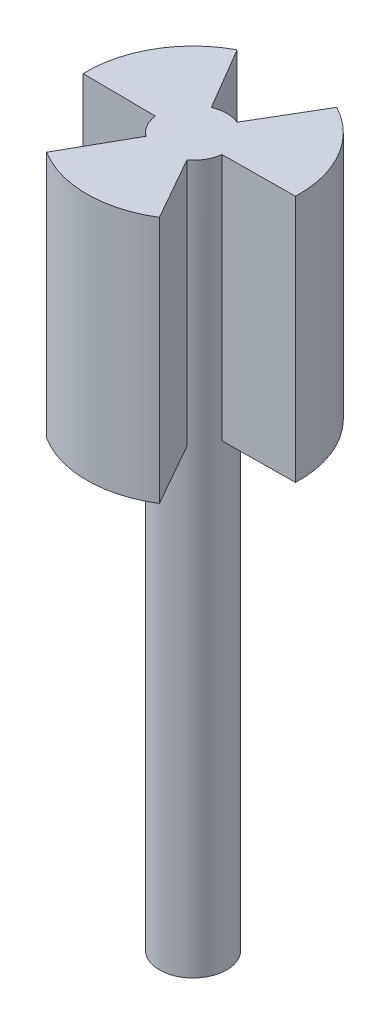
ISO-10303-21;
HEADER;
FILE_DESCRIPTION(('STEP AP214'),'2;1');
FILE_NAME('part.step','',(''),(''),'','','');
FILE_SCHEMA(('AUTOMOTIVE_DESIGN { 1 0 10303 214 1 1 1 1 }'));
ENDSEC;
DATA;
#1=APPLICATION_CONTEXT('core data for automotive mechanical design processes');
#2=APPLICATION_PROTOCOL_DEFINITION('international standard','automotive_design',2000,#1);
#3=PRODUCT_CONTEXT('',#1,'mechanical');
#4=PRODUCT('Part','Part','',(#3));
#5=PRODUCT_RELATED_PRODUCT_CATEGORY('part','',(#4));
#6=PRODUCT_DEFINITION_FORMATION('','',#4);
#7=PRODUCT_DEFINITION_CONTEXT('part definition',#1,'design');
#8=PRODUCT_DEFINITION('design','',#6,#7);
#9=PRODUCT_DEFINITION_SHAPE('','',#8);
#10=(LENGTH_UNIT() NAMED_UNIT(*) SI_UNIT(.MILLI.,.METRE.));
#11=(NAMED_UNIT(*) PLANE_ANGLE_UNIT() SI_UNIT($,.RADIAN.));
#12=(NAMED_UNIT(*) SI_UNIT($,.STERADIAN.) SOLID_ANGLE_UNIT());
#13=UNCERTAINTY_MEASURE_WITH_UNIT(LENGTH_MEASURE(1.E-05),#10,'distance_accuracy_value','');
#14=(GEOMETRIC_REPRESENTATION_CONTEXT(3) GLOBAL_UNCERTAINTY_ASSIGNED_CONTEXT((#13)) GLOBAL_UNIT_ASSIGNED_CONTEXT((#10,
#11,#12)) REPRESENTATION_CONTEXT('',''));
#15=CARTESIAN_POINT('',(0.,0.,0.));
#16=DIRECTION('',(0.,0.,1.));
#17=DIRECTION('',(1.,0.,0.));
#18=AXIS2_PLACEMENT_3D('',#15,#16,#17);
#19=CARTESIAN_POINT('',(0.,200.,0.));
#20=DIRECTION('',(0.,1.,0.));
#21=DIRECTION('',(0.,0.,1.));
#22=AXIS2_PLACEMENT_3D('',#19,#20,#21);
#23=PLANE('',#22);
#24=DIRECTION('',(-0.492207128969492,0.,-0.870478111265074));
#25=VECTOR('',#24,1.);
#26=CARTESIAN_POINT('',(22.4530319302345,200.,36.987220273007));
#27=LINE('',#26,#25);
#28=CARTESIAN_POINT('',(15.9174922571403,200.,25.428988187576));
#29=VERTEX_POINT('',#28);
#30=CARTESIAN_POINT('',(5.79525781005714,200.,7.5276149552811));
#31=VERTEX_POINT('',#30);
#32=EDGE_CURVE('E131',#29,#31,#27,.T.);
#33=ORIENTED_EDGE('',*,*,#32,.T.);
#34=CARTESIAN_POINT('',(0.,200.,0.));
#35=DIRECTION('',(0.,1.,0.));
#36=DIRECTION('',(0.866025403784443,0.,0.499999999999992));
#37=AXIS2_PLACEMENT_3D('',#34,#35,#36);
#38=CIRCLE('',#37,9.49999999999999);
#39=CARTESIAN_POINT('',(9.41673468620969,200.,1.25503300734893));
#40=VERTEX_POINT('',#39);
#41=EDGE_CURVE('E138',#31,#40,#38,.T.);
#42=ORIENTED_EDGE('',*,*,#41,.T.);
#43=DIRECTION('',(0.999959722278597,0.,-0.00897517802117143));
#44=VECTOR('',#43,1.);
#45=CARTESIAN_POINT('',(43.2583883369122,200.,0.951285907061967));
#46=LINE('',#45,#44);
#47=CARTESIAN_POINT('',(29.9808958915454,200.,1.07045856543703));
#48=VERTEX_POINT('',#47);
#49=EDGE_CURVE('E135',#40,#48,#46,.T.);
#50=ORIENTED_EDGE('',*,*,#49,.T.);
#51=CARTESIAN_POINT('',(0.,200.,0.));
#52=DIRECTION('',(0.,1.,0.));
#53=DIRECTION('',(0.,0.,1.));
#54=AXIS2_PLACEMENT_3D('',#51,#52,#53);
#55=CIRCLE('',#54,30.);
#56=CARTESIAN_POINT('',(14.0634036344053,200.,-26.4994467530134));
#57=VERTEX_POINT('',#56);
#58=EDGE_CURVE('E196',#48,#57,#55,.T.);
#59=ORIENTED_EDGE('',*,*,#58,.T.);
#60=DIRECTION('',(0.507752593309113,0.,-0.861502933243916));
#61=VECTOR('',#60,1.);
#62=CARTESIAN_POINT('',(-1.15398259986249,200.,-0.680134257358214));
#63=LINE('',#62,#61);
#64=CARTESIAN_POINT('',(3.62147687615261,200.,-8.78264796263017));
#65=VERTEX_POINT('',#64);
#66=EDGE_CURVE('E212',#65,#57,#63,.T.);
#67=ORIENTED_EDGE('',*,*,#66,.F.);
#68=CARTESIAN_POINT('',(0.,200.,0.));
#69=DIRECTION('',(0.,1.,0.));
#70=DIRECTION('',(0.,0.,-1.));
#71=AXIS2_PLACEMENT_3D('',#68,#69,#70);
#72=CIRCLE('',#71,9.49999999999999);
#73=CARTESIAN_POINT('',(-3.6214768761526,200.,-8.78264796263017));
#74=VERTEX_POINT('',#73);
#75=EDGE_CURVE('E176',#65,#74,#72,.T.);
#76=ORIENTED_EDGE('',*,*,#75,.T.);
#77=DIRECTION('',(-0.507752593309113,0.,-0.861502933243916));
#78=VECTOR('',#77,1.);
#79=CARTESIAN_POINT('',(-20.805356406678,200.,-37.9385061800696));
#80=LINE('',#79,#78);
#81=CARTESIAN_POINT('',(-14.0634036344053,200.,-26.4994467530134));
#82=VERTEX_POINT('',#81);
#83=EDGE_CURVE('E179',#74,#82,#80,.T.);
#84=ORIENTED_EDGE('',*,*,#83,.T.);
#85=CARTESIAN_POINT('',(-29.9808958915454,200.,1.07045856543743));
#86=VERTEX_POINT('',#85);
#87=EDGE_CURVE('E203',#82,#86,#55,.T.);
#88=ORIENTED_EDGE('',*,*,#87,.T.);
#89=DIRECTION('',(0.999959722278597,0.,0.00897517802115771));
#90=VECTOR('',#89,1.);
#91=CARTESIAN_POINT('',(-43.2583883369122,200.,0.951285907062557));
#92=LINE('',#91,#90);
#93=CARTESIAN_POINT('',(-9.41673468620967,200.,1.25503300734906));
#94=VERTEX_POINT('',#93);
#95=EDGE_CURVE('E159',#86,#94,#92,.T.);
#96=ORIENTED_EDGE('',*,*,#95,.T.);
#97=CARTESIAN_POINT('',(0.,200.,0.));
#98=DIRECTION('',(0.,1.,0.));
#99=DIRECTION('',(-0.866025403784436,0.,0.500000000000004));
#100=AXIS2_PLACEMENT_3D('',#97,#98,#99);
#101=CIRCLE('',#100,9.49999999999999);
#102=CARTESIAN_POINT('',(-5.79525781005704,200.,7.52761495528118));
#103=VERTEX_POINT('',#102);
#104=EDGE_CURVE('E162',#94,#103,#101,.T.);
#105=ORIENTED_EDGE('',*,*,#104,.T.);
#106=DIRECTION('',(-0.49220712896948,0.,0.870478111265081));
#107=VECTOR('',#106,1.);
#108=CARTESIAN_POINT('',(-22.4530319302341,200.,36.9872202730073));
#109=LINE('',#108,#107);
#110=CARTESIAN_POINT('',(-15.9174922571399,200.,25.4289881875762));
#111=VERTEX_POINT('',#110);
#112=EDGE_CURVE('E165',#103,#111,#109,.T.);
#113=ORIENTED_EDGE('',*,*,#112,.T.);
#114=EDGE_CURVE('E147',#111,#29,#55,.T.);
#115=ORIENTED_EDGE('',*,*,#114,.T.);
#116=EDGE_LOOP('',(#33,#42,#50,#59,#67,#76,#84,#88,#96,#105,#113,#115));
#117=FACE_BOUND('',#116,.T.);
#118=ADVANCED_FACE('F41',(#117),#23,.T.);
#119=CARTESIAN_POINT('',(0.,130.,0.));
#120=DIRECTION('',(0.,1.,0.));
#121=DIRECTION('',(0.,0.,1.));
#122=AXIS2_PLACEMENT_3D('',#119,#120,#121);
#123=CYLINDRICAL_SURFACE('',#122,30.);
#124=DIRECTION('',(0.,1.,0.));
#125=VECTOR('',#124,1.);
#126=CARTESIAN_POINT('',(15.9174922571403,130.,25.428988187576));
#127=LINE('',#126,#125);
#128=CARTESIAN_POINT('',(15.9174922571403,130.,25.428988187576));
#129=VERTEX_POINT('',#128);
#130=EDGE_CURVE('E156',#29,#129,#127,.F.);
#131=ORIENTED_EDGE('',*,*,#130,.F.);
#132=ORIENTED_EDGE('',*,*,#114,.F.);
#133=DIRECTION('',(0.,1.,0.));
#134=VECTOR('',#133,1.);
#135=CARTESIAN_POINT('',(-15.9174922571399,130.,25.4289881875762));
#136=LINE('',#135,#134);
#137=CARTESIAN_POINT('',(-15.9174922571399,130.,25.4289881875762));
#138=VERTEX_POINT('',#137);
#139=EDGE_CURVE('E170',#138,#111,#136,.T.);
#140=ORIENTED_EDGE('',*,*,#139,.F.);
#141=CARTESIAN_POINT('',(0.,130.,0.));
#142=DIRECTION('',(0.,1.,0.));
#143=DIRECTION('',(0.,0.,1.));
#144=AXIS2_PLACEMENT_3D('',#141,#142,#143);
#145=CIRCLE('',#144,30.);
#146=EDGE_CURVE('E201',#138,#129,#145,.T.);
#147=ORIENTED_EDGE('',*,*,#146,.T.);
#148=EDGE_LOOP('',(#131,#132,#140,#147));
#149=FACE_BOUND('',#148,.T.);
#150=ADVANCED_FACE('F258',(#149),#123,.T.);
#151=CARTESIAN_POINT('',(0.,130.,0.));
#152=DIRECTION('',(0.,1.,0.));
#153=DIRECTION('',(0.,0.,1.));
#154=AXIS2_PLACEMENT_3D('',#151,#152,#153);
#155=PLANE('',#154);
#156=CARTESIAN_POINT('',(0.,130.,0.));
#157=DIRECTION('',(0.,1.,0.));
#158=DIRECTION('',(0.,0.,1.));
#159=AXIS2_PLACEMENT_3D('',#156,#157,#158);
#160=CIRCLE('',#159,9.5);
#161=CARTESIAN_POINT('',(-5.79525781005704,130.,7.52761495528118));
#162=VERTEX_POINT('',#161);
#163=CARTESIAN_POINT('',(5.79525781005714,130.,7.5276149552811));
#164=VERTEX_POINT('',#163);
#165=EDGE_CURVE('E213',#162,#164,#160,.T.);
#166=ORIENTED_EDGE('',*,*,#165,.T.);
#167=DIRECTION('',(0.492207128969492,0.,0.870478111265074));
#168=VECTOR('',#167,1.);
#169=CARTESIAN_POINT('',(1.16600484478752,130.,-0.659311118327038));
#170=LINE('',#169,#168);
#171=EDGE_CURVE('E11',#164,#129,#170,.T.);
#172=ORIENTED_EDGE('',*,*,#171,.T.);
#173=ORIENTED_EDGE('',*,*,#146,.F.);
#174=DIRECTION('',(-0.49220712896948,0.,0.870478111265081));
#175=VECTOR('',#174,1.);
#176=CARTESIAN_POINT('',(-22.4530319302341,130.,36.9872202730073));
#177=LINE('',#176,#175);
#178=EDGE_CURVE('E158',#162,#138,#177,.T.);
#179=ORIENTED_EDGE('',*,*,#178,.F.);
#180=EDGE_LOOP('',(#166,#172,#173,#179));
#181=FACE_BOUND('',#180,.T.);
#182=ADVANCED_FACE('F241',(#181),#155,.F.);
#183=DIRECTION('',(0.,1.,0.));
#184=VECTOR('',#183,1.);
#185=CARTESIAN_POINT('',(-29.9808958915454,130.,1.07045856543743));
#186=LINE('',#185,#184);
#187=CARTESIAN_POINT('',(-29.9808958915454,130.,1.07045856543743));
#188=VERTEX_POINT('',#187);
#189=EDGE_CURVE('E173',#86,#188,#186,.F.);
#190=ORIENTED_EDGE('',*,*,#189,.F.);
#191=ORIENTED_EDGE('',*,*,#87,.F.);
#192=DIRECTION('',(0.,1.,0.));
#193=VECTOR('',#192,1.);
#194=CARTESIAN_POINT('',(-14.0634036344053,130.,-26.4994467530134));
#195=LINE('',#194,#193);
#196=CARTESIAN_POINT('',(-14.0634036344053,130.,-26.4994467530134));
#197=VERTEX_POINT('',#196);
#198=EDGE_CURVE('E189',#197,#82,#195,.T.);
#199=ORIENTED_EDGE('',*,*,#198,.F.);
#200=EDGE_CURVE('E197',#197,#188,#145,.T.);
#201=ORIENTED_EDGE('',*,*,#200,.T.);
#202=EDGE_LOOP('',(#190,#191,#199,#201));
#203=FACE_BOUND('',#202,.T.);
#204=ADVANCED_FACE('F224',(#203),#123,.T.);
#205=CARTESIAN_POINT('',(-3.62147687615261,130.,-8.78264796263017));
#206=VERTEX_POINT('',#205);
#207=CARTESIAN_POINT('',(-9.41673468620967,130.,1.25503300734906));
#208=VERTEX_POINT('',#207);
#209=EDGE_CURVE('E209',#206,#208,#160,.T.);
#210=ORIENTED_EDGE('',*,*,#209,.T.);
#211=DIRECTION('',(-0.999959722278597,0.,-0.00897517802115771));
#212=VECTOR('',#211,1.);
#213=CARTESIAN_POINT('',(-0.0120222449250232,130.,1.33944537568524));
#214=LINE('',#213,#212);
#215=EDGE_CURVE('E49',#208,#188,#214,.T.);
#216=ORIENTED_EDGE('',*,*,#215,.T.);
#217=ORIENTED_EDGE('',*,*,#200,.F.);
#218=DIRECTION('',(-0.507752593309113,0.,-0.861502933243916));
#219=VECTOR('',#218,1.);
#220=CARTESIAN_POINT('',(-20.805356406678,130.,-37.9385061800696));
#221=LINE('',#220,#219);
#222=EDGE_CURVE('E180',#206,#197,#221,.T.);
#223=ORIENTED_EDGE('',*,*,#222,.F.);
#224=EDGE_LOOP('',(#210,#216,#217,#223));
#225=FACE_BOUND('',#224,.T.);
#226=ADVANCED_FACE('F218',(#225),#155,.F.);
#227=CARTESIAN_POINT('',(0.,200.,0.));
#228=DIRECTION('',(0.,-1.,0.));
#229=DIRECTION('',(0.,0.,-1.));
#230=AXIS2_PLACEMENT_3D('',#227,#228,#229);
#231=CYLINDRICAL_SURFACE('',#230,9.5);
#232=CARTESIAN_POINT('',(0.,0.,0.));
#233=DIRECTION('',(0.,1.,0.));
#234=DIRECTION('',(0.,0.,1.));
#235=AXIS2_PLACEMENT_3D('',#232,#233,#234);
#236=CIRCLE('',#235,9.5);
#237=CARTESIAN_POINT('',(0.,0.,9.5));
#238=VERTEX_POINT('',#237);
#239=EDGE_CURVE('E200',#238,#238,#236,.T.);
#240=ORIENTED_EDGE('',*,*,#239,.T.);
#241=EDGE_LOOP('',(#240));
#242=FACE_BOUND('',#241,.T.);
#243=ORIENTED_EDGE('',*,*,#209,.F.);
#244=DIRECTION('',(0.,-1.,0.));
#245=VECTOR('',#244,1.);
#246=CARTESIAN_POINT('',(-3.62147687615261,200.,-8.78264796263017));
#247=LINE('',#246,#245);
#248=EDGE_CURVE('E187',#74,#206,#247,.T.);
#249=ORIENTED_EDGE('',*,*,#248,.F.);
#250=ORIENTED_EDGE('',*,*,#75,.F.);
#251=DIRECTION('',(0.,-1.,0.));
#252=VECTOR('',#251,1.);
#253=CARTESIAN_POINT('',(3.62147687615261,200.,-8.78264796263017));
#254=LINE('',#253,#252);
#255=CARTESIAN_POINT('',(3.62147687615261,130.,-8.78264796263017));
#256=VERTEX_POINT('',#255);
#257=EDGE_CURVE('E183',#65,#256,#254,.T.);
#258=ORIENTED_EDGE('',*,*,#257,.T.);
#259=CARTESIAN_POINT('',(9.41673468620969,130.,1.25503300734893));
#260=VERTEX_POINT('',#259);
#261=EDGE_CURVE('E208',#260,#256,#160,.T.);
#262=ORIENTED_EDGE('',*,*,#261,.F.);
#263=DIRECTION('',(0.,-1.,0.));
#264=VECTOR('',#263,1.);
#265=CARTESIAN_POINT('',(9.41673468620969,200.,1.25503300734893));
#266=LINE('',#265,#264);
#267=EDGE_CURVE('E134',#40,#260,#266,.T.);
#268=ORIENTED_EDGE('',*,*,#267,.F.);
#269=ORIENTED_EDGE('',*,*,#41,.F.);
#270=DIRECTION('',(0.,-1.,0.));
#271=VECTOR('',#270,1.);
#272=CARTESIAN_POINT('',(5.79525781005714,200.,7.5276149552811));
#273=LINE('',#272,#271);
#274=EDGE_CURVE('E56',#31,#164,#273,.T.);
#275=ORIENTED_EDGE('',*,*,#274,.T.);
#276=ORIENTED_EDGE('',*,*,#165,.F.);
#277=DIRECTION('',(0.,-1.,0.));
#278=VECTOR('',#277,1.);
#279=CARTESIAN_POINT('',(-5.79525781005704,200.,7.52761495528118));
#280=LINE('',#279,#278);
#281=EDGE_CURVE('E168',#103,#162,#280,.T.);
#282=ORIENTED_EDGE('',*,*,#281,.F.);
#283=ORIENTED_EDGE('',*,*,#104,.F.);
#284=DIRECTION('',(0.,-1.,0.));
#285=VECTOR('',#284,1.);
#286=CARTESIAN_POINT('',(-9.41673468620967,200.,1.25503300734906));
#287=LINE('',#286,#285);
#288=EDGE_CURVE('E63',#94,#208,#287,.T.);
#289=ORIENTED_EDGE('',*,*,#288,.T.);
#290=EDGE_LOOP('',(#243,#249,#250,#258,#262,#268,#269,#275,#276,#282,#283,#289));
#291=FACE_BOUND('',#290,.T.);
#292=ADVANCED_FACE('F43',(#242,#291),#231,.T.);
#293=CARTESIAN_POINT('',(0.,0.,0.));
#294=DIRECTION('',(0.,1.,0.));
#295=DIRECTION('',(0.,0.,1.));
#296=AXIS2_PLACEMENT_3D('',#293,#294,#295);
#297=PLANE('',#296);
#298=ORIENTED_EDGE('',*,*,#239,.F.);
#299=EDGE_LOOP('',(#298));
#300=FACE_BOUND('',#299,.T.);
#301=ADVANCED_FACE('F267',(#300),#297,.F.);
#302=DIRECTION('',(0.,1.,0.));
#303=VECTOR('',#302,1.);
#304=CARTESIAN_POINT('',(29.9808958915454,130.,1.07045856543703));
#305=LINE('',#304,#303);
#306=CARTESIAN_POINT('',(29.9808958915454,130.,1.07045856543703));
#307=VERTEX_POINT('',#306);
#308=EDGE_CURVE('E153',#307,#48,#305,.T.);
#309=ORIENTED_EDGE('',*,*,#308,.F.);
#310=CARTESIAN_POINT('',(14.0634036344053,130.,-26.4994467530134));
#311=VERTEX_POINT('',#310);
#312=EDGE_CURVE('E202',#307,#311,#145,.T.);
#313=ORIENTED_EDGE('',*,*,#312,.T.);
#314=DIRECTION('',(0.,1.,0.));
#315=VECTOR('',#314,1.);
#316=CARTESIAN_POINT('',(14.0634036344053,130.,-26.4994467530134));
#317=LINE('',#316,#315);
#318=EDGE_CURVE('E193',#57,#311,#317,.F.);
#319=ORIENTED_EDGE('',*,*,#318,.F.);
#320=ORIENTED_EDGE('',*,*,#58,.F.);
#321=EDGE_LOOP('',(#309,#313,#319,#320));
#322=FACE_BOUND('',#321,.T.);
#323=ADVANCED_FACE('F265',(#322),#123,.T.);
#324=ORIENTED_EDGE('',*,*,#312,.F.);
#325=DIRECTION('',(0.999959722278597,0.,-0.00897517802117143));
#326=VECTOR('',#325,1.);
#327=CARTESIAN_POINT('',(43.2583883369122,130.,0.951285907061967));
#328=LINE('',#327,#326);
#329=EDGE_CURVE('E148',#260,#307,#328,.T.);
#330=ORIENTED_EDGE('',*,*,#329,.F.);
#331=ORIENTED_EDGE('',*,*,#261,.T.);
#332=DIRECTION('',(-0.507752593309113,0.,0.861502933243916));
#333=VECTOR('',#332,1.);
#334=CARTESIAN_POINT('',(20.805356406678,130.,-37.9385061800696));
#335=LINE('',#334,#333);
#336=EDGE_CURVE('E175',#311,#256,#335,.T.);
#337=ORIENTED_EDGE('',*,*,#336,.F.);
#338=EDGE_LOOP('',(#324,#330,#331,#337));
#339=FACE_BOUND('',#338,.T.);
#340=ADVANCED_FACE('F237',(#339),#155,.F.);
#341=CARTESIAN_POINT('',(20.805356406678,200.,-37.9385061800696));
#342=DIRECTION('',(0.861502933243916,0.,0.507752593309113));
#343=DIRECTION('',(0.507752593309113,0.,-0.861502933243916));
#344=AXIS2_PLACEMENT_3D('',#341,#342,#343);
#345=PLANE('',#344);
#346=ORIENTED_EDGE('',*,*,#318,.T.);
#347=ORIENTED_EDGE('',*,*,#336,.T.);
#348=ORIENTED_EDGE('',*,*,#257,.F.);
#349=ORIENTED_EDGE('',*,*,#66,.T.);
#350=EDGE_LOOP('',(#346,#347,#348,#349));
#351=FACE_BOUND('',#350,.T.);
#352=ADVANCED_FACE('F232',(#351),#345,.F.);
#353=CARTESIAN_POINT('',(-20.805356406678,200.,-37.9385061800696));
#354=DIRECTION('',(-0.861502933243916,0.,0.507752593309113));
#355=DIRECTION('',(0.507752593309113,0.,0.861502933243916));
#356=AXIS2_PLACEMENT_3D('',#353,#354,#355);
#357=PLANE('',#356);
#358=ORIENTED_EDGE('',*,*,#198,.T.);
#359=ORIENTED_EDGE('',*,*,#83,.F.);
#360=ORIENTED_EDGE('',*,*,#248,.T.);
#361=ORIENTED_EDGE('',*,*,#222,.T.);
#362=EDGE_LOOP('',(#358,#359,#360,#361));
#363=FACE_BOUND('',#362,.T.);
#364=ADVANCED_FACE('F227',(#363),#357,.F.);
#365=CARTESIAN_POINT('',(-43.2583883369122,200.,0.951285907062557));
#366=DIRECTION('',(0.00897517802115771,0.,-0.999959722278597));
#367=DIRECTION('',(-0.999959722278597,0.,-0.00897517802115771));
#368=AXIS2_PLACEMENT_3D('',#365,#366,#367);
#369=PLANE('',#368);
#370=ORIENTED_EDGE('',*,*,#189,.T.);
#371=ORIENTED_EDGE('',*,*,#215,.F.);
#372=ORIENTED_EDGE('',*,*,#288,.F.);
#373=ORIENTED_EDGE('',*,*,#95,.F.);
#374=EDGE_LOOP('',(#370,#371,#372,#373));
#375=FACE_BOUND('',#374,.T.);
#376=ADVANCED_FACE('F248',(#375),#369,.F.);
#377=CARTESIAN_POINT('',(-22.4530319302341,200.,36.9872202730073));
#378=DIRECTION('',(0.87047811126508,0.,0.49220712896948));
#379=DIRECTION('',(0.49220712896948,0.,-0.87047811126508));
#380=AXIS2_PLACEMENT_3D('',#377,#378,#379);
#381=PLANE('',#380);
#382=ORIENTED_EDGE('',*,*,#139,.T.);
#383=ORIENTED_EDGE('',*,*,#112,.F.);
#384=ORIENTED_EDGE('',*,*,#281,.T.);
#385=ORIENTED_EDGE('',*,*,#178,.T.);
#386=EDGE_LOOP('',(#382,#383,#384,#385));
#387=FACE_BOUND('',#386,.T.);
#388=ADVANCED_FACE('F246',(#387),#381,.F.);
#389=CARTESIAN_POINT('',(22.4530319302345,200.,36.987220273007));
#390=DIRECTION('',(-0.870478111265074,0.,0.492207128969492));
#391=DIRECTION('',(0.492207128969492,0.,0.870478111265074));
#392=AXIS2_PLACEMENT_3D('',#389,#390,#391);
#393=PLANE('',#392);
#394=ORIENTED_EDGE('',*,*,#130,.T.);
#395=ORIENTED_EDGE('',*,*,#171,.F.);
#396=ORIENTED_EDGE('',*,*,#274,.F.);
#397=ORIENTED_EDGE('',*,*,#32,.F.);
#398=EDGE_LOOP('',(#394,#395,#396,#397));
#399=FACE_BOUND('',#398,.T.);
#400=ADVANCED_FACE('F129',(#399),#393,.F.);
#401=CARTESIAN_POINT('',(43.2583883369122,200.,0.951285907061967));
#402=DIRECTION('',(-0.00897517802117143,0.,-0.999959722278597));
#403=DIRECTION('',(-0.999959722278597,0.,0.00897517802117143));
#404=AXIS2_PLACEMENT_3D('',#401,#402,#403);
#405=PLANE('',#404);
#406=ORIENTED_EDGE('',*,*,#308,.T.);
#407=ORIENTED_EDGE('',*,*,#49,.F.);
#408=ORIENTED_EDGE('',*,*,#267,.T.);
#409=ORIENTED_EDGE('',*,*,#329,.T.);
#410=EDGE_LOOP('',(#406,#407,#408,#409));
#411=FACE_BOUND('',#410,.T.);
#412=ADVANCED_FACE('F352',(#411),#405,.F.);
#413=CLOSED_SHELL('',(#118,#150,#182,#204,#226,#292,#301,#323,#340,#352,#364,#376,#388,#400,#412));
#414=MANIFOLD_SOLID_BREP('B2',#413);
#415=ADVANCED_BREP_SHAPE_REPRESENTATION('',(#18,#414),#14);
#416=SHAPE_DEFINITION_REPRESENTATION(#9,#415);
ENDSEC;
END-ISO-10303-21;
